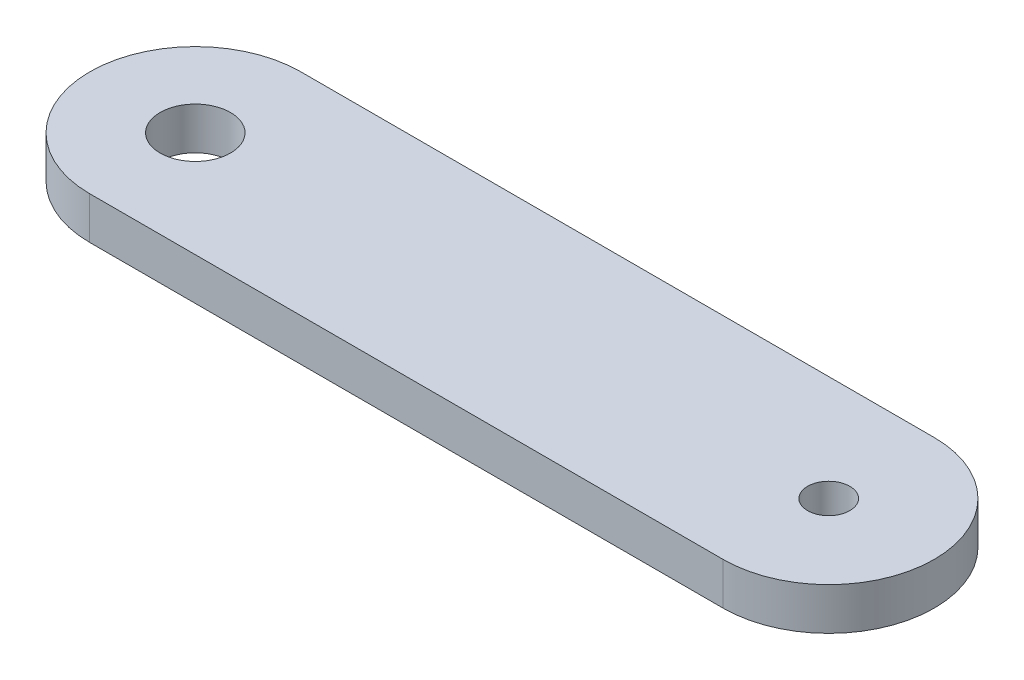
ISO-10303-21;
HEADER;
FILE_DESCRIPTION(('STEP AP214'),'2;1');
FILE_NAME('part.step','',(''),(''),'','','');
FILE_SCHEMA(('AUTOMOTIVE_DESIGN { 1 0 10303 214 1 1 1 1 }'));
ENDSEC;
DATA;
#1=APPLICATION_CONTEXT('core data for automotive mechanical design processes');
#2=APPLICATION_PROTOCOL_DEFINITION('international standard','automotive_design',2000,#1);
#3=PRODUCT_CONTEXT('',#1,'mechanical');
#4=PRODUCT('Part','Part','',(#3));
#5=PRODUCT_RELATED_PRODUCT_CATEGORY('part','',(#4));
#6=PRODUCT_DEFINITION_FORMATION('','',#4);
#7=PRODUCT_DEFINITION_CONTEXT('part definition',#1,'design');
#8=PRODUCT_DEFINITION('design','',#6,#7);
#9=PRODUCT_DEFINITION_SHAPE('','',#8);
#10=(LENGTH_UNIT() NAMED_UNIT(*) SI_UNIT(.MILLI.,.METRE.));
#11=(NAMED_UNIT(*) PLANE_ANGLE_UNIT() SI_UNIT($,.RADIAN.));
#12=(NAMED_UNIT(*) SI_UNIT($,.STERADIAN.) SOLID_ANGLE_UNIT());
#13=UNCERTAINTY_MEASURE_WITH_UNIT(LENGTH_MEASURE(1.E-05),#10,'distance_accuracy_value','');
#14=(GEOMETRIC_REPRESENTATION_CONTEXT(3) GLOBAL_UNCERTAINTY_ASSIGNED_CONTEXT((#13)) GLOBAL_UNIT_ASSIGNED_CONTEXT((#10,
#11,#12)) REPRESENTATION_CONTEXT('',''));
#15=CARTESIAN_POINT('',(0.,0.,0.));
#16=DIRECTION('',(0.,0.,1.));
#17=DIRECTION('',(1.,0.,0.));
#18=AXIS2_PLACEMENT_3D('',#15,#16,#17);
#19=CARTESIAN_POINT('',(45.,6.,0.));
#20=DIRECTION('',(0.,1.,0.));
#21=DIRECTION('',(0.,0.,1.));
#22=AXIS2_PLACEMENT_3D('',#19,#20,#21);
#23=PLANE('',#22);
#24=CARTESIAN_POINT('',(-45.,6.,0.));
#25=DIRECTION('',(0.,1.,0.));
#26=DIRECTION('',(0.,0.,1.));
#27=AXIS2_PLACEMENT_3D('',#24,#25,#26);
#28=CIRCLE('',#27,5.);
#29=CARTESIAN_POINT('',(-45.,6.,5.));
#30=VERTEX_POINT('',#29);
#31=EDGE_CURVE('E112',#30,#30,#28,.T.);
#32=ORIENTED_EDGE('',*,*,#31,.F.);
#33=EDGE_LOOP('',(#32));
#34=FACE_BOUND('',#33,.T.);
#35=CARTESIAN_POINT('',(45.,6.,0.));
#36=DIRECTION('',(0.,1.,0.));
#37=DIRECTION('',(0.,0.,1.));
#38=AXIS2_PLACEMENT_3D('',#35,#36,#37);
#39=CIRCLE('',#38,15.);
#40=CARTESIAN_POINT('',(45.,6.,15.));
#41=VERTEX_POINT('',#40);
#42=CARTESIAN_POINT('',(45.,6.,-15.));
#43=VERTEX_POINT('',#42);
#44=EDGE_CURVE('E92',#41,#43,#39,.T.);
#45=ORIENTED_EDGE('',*,*,#44,.T.);
#46=DIRECTION('',(-1.,0.,0.));
#47=VECTOR('',#46,1.);
#48=CARTESIAN_POINT('',(-45.,6.,-15.));
#49=LINE('',#48,#47);
#50=CARTESIAN_POINT('',(-45.,6.,-15.));
#51=VERTEX_POINT('',#50);
#52=EDGE_CURVE('E87',#43,#51,#49,.T.);
#53=ORIENTED_EDGE('',*,*,#52,.T.);
#54=CARTESIAN_POINT('',(-45.,6.,0.));
#55=DIRECTION('',(0.,1.,0.));
#56=DIRECTION('',(0.,0.,1.));
#57=AXIS2_PLACEMENT_3D('',#54,#55,#56);
#58=CIRCLE('',#57,15.);
#59=CARTESIAN_POINT('',(-45.,6.,15.));
#60=VERTEX_POINT('',#59);
#61=EDGE_CURVE('E90',#51,#60,#58,.T.);
#62=ORIENTED_EDGE('',*,*,#61,.T.);
#63=DIRECTION('',(1.,0.,0.));
#64=VECTOR('',#63,1.);
#65=CARTESIAN_POINT('',(-45.,6.,15.));
#66=LINE('',#65,#64);
#67=EDGE_CURVE('E57',#60,#41,#66,.T.);
#68=ORIENTED_EDGE('',*,*,#67,.T.);
#69=EDGE_LOOP('',(#45,#53,#62,#68));
#70=FACE_BOUND('',#69,.T.);
#71=CARTESIAN_POINT('',(45.,6.,0.));
#72=DIRECTION('',(0.,1.,0.));
#73=DIRECTION('',(0.,0.,1.));
#74=AXIS2_PLACEMENT_3D('',#71,#72,#73);
#75=CIRCLE('',#74,3.);
#76=CARTESIAN_POINT('',(45.,6.,3.));
#77=VERTEX_POINT('',#76);
#78=EDGE_CURVE('E134',#77,#77,#75,.T.);
#79=ORIENTED_EDGE('',*,*,#78,.F.);
#80=EDGE_LOOP('',(#79));
#81=FACE_BOUND('',#80,.T.);
#82=ADVANCED_FACE('F39',(#34,#70,#81),#23,.T.);
#83=CARTESIAN_POINT('',(45.,0.,0.));
#84=DIRECTION('',(0.,1.,0.));
#85=DIRECTION('',(0.,0.,1.));
#86=AXIS2_PLACEMENT_3D('',#83,#84,#85);
#87=PLANE('',#86);
#88=CARTESIAN_POINT('',(45.,0.,0.));
#89=DIRECTION('',(0.,1.,0.));
#90=DIRECTION('',(0.,0.,1.));
#91=AXIS2_PLACEMENT_3D('',#88,#89,#90);
#92=CIRCLE('',#91,15.);
#93=CARTESIAN_POINT('',(45.,0.,15.));
#94=VERTEX_POINT('',#93);
#95=CARTESIAN_POINT('',(45.,0.,-15.));
#96=VERTEX_POINT('',#95);
#97=EDGE_CURVE('E108',#94,#96,#92,.T.);
#98=ORIENTED_EDGE('',*,*,#97,.F.);
#99=DIRECTION('',(1.,0.,0.));
#100=VECTOR('',#99,1.);
#101=CARTESIAN_POINT('',(-45.,0.,15.));
#102=LINE('',#101,#100);
#103=CARTESIAN_POINT('',(-45.,0.,15.));
#104=VERTEX_POINT('',#103);
#105=EDGE_CURVE('E80',#104,#94,#102,.T.);
#106=ORIENTED_EDGE('',*,*,#105,.F.);
#107=CARTESIAN_POINT('',(-45.,0.,0.));
#108=DIRECTION('',(0.,1.,0.));
#109=DIRECTION('',(0.,0.,1.));
#110=AXIS2_PLACEMENT_3D('',#107,#108,#109);
#111=CIRCLE('',#110,15.);
#112=CARTESIAN_POINT('',(-45.,0.,-15.));
#113=VERTEX_POINT('',#112);
#114=EDGE_CURVE('E74',#113,#104,#111,.T.);
#115=ORIENTED_EDGE('',*,*,#114,.F.);
#116=DIRECTION('',(-1.,0.,0.));
#117=VECTOR('',#116,1.);
#118=CARTESIAN_POINT('',(-45.,0.,-15.));
#119=LINE('',#118,#117);
#120=EDGE_CURVE('E97',#96,#113,#119,.T.);
#121=ORIENTED_EDGE('',*,*,#120,.F.);
#122=EDGE_LOOP('',(#98,#106,#115,#121));
#123=FACE_BOUND('',#122,.T.);
#124=CARTESIAN_POINT('',(-45.,0.,0.));
#125=DIRECTION('',(0.,1.,0.));
#126=DIRECTION('',(0.,0.,1.));
#127=AXIS2_PLACEMENT_3D('',#124,#125,#126);
#128=CIRCLE('',#127,5.);
#129=CARTESIAN_POINT('',(-45.,0.,5.));
#130=VERTEX_POINT('',#129);
#131=EDGE_CURVE('E130',#130,#130,#128,.T.);
#132=ORIENTED_EDGE('',*,*,#131,.T.);
#133=EDGE_LOOP('',(#132));
#134=FACE_BOUND('',#133,.T.);
#135=CARTESIAN_POINT('',(45.,0.,0.));
#136=DIRECTION('',(0.,1.,0.));
#137=DIRECTION('',(0.,0.,1.));
#138=AXIS2_PLACEMENT_3D('',#135,#136,#137);
#139=CIRCLE('',#138,3.);
#140=CARTESIAN_POINT('',(45.,0.,3.));
#141=VERTEX_POINT('',#140);
#142=EDGE_CURVE('E138',#141,#141,#139,.T.);
#143=ORIENTED_EDGE('',*,*,#142,.T.);
#144=EDGE_LOOP('',(#143));
#145=FACE_BOUND('',#144,.T.);
#146=ADVANCED_FACE('F125',(#123,#134,#145),#87,.F.);
#147=CARTESIAN_POINT('',(45.,6.,0.));
#148=DIRECTION('',(0.,-1.,0.));
#149=DIRECTION('',(0.,0.,-1.));
#150=AXIS2_PLACEMENT_3D('',#147,#148,#149);
#151=CYLINDRICAL_SURFACE('',#150,15.);
#152=ORIENTED_EDGE('',*,*,#97,.T.);
#153=DIRECTION('',(0.,-1.,0.));
#154=VECTOR('',#153,1.);
#155=CARTESIAN_POINT('',(45.,6.,-15.));
#156=LINE('',#155,#154);
#157=EDGE_CURVE('E11',#43,#96,#156,.T.);
#158=ORIENTED_EDGE('',*,*,#157,.F.);
#159=ORIENTED_EDGE('',*,*,#44,.F.);
#160=DIRECTION('',(0.,-1.,0.));
#161=VECTOR('',#160,1.);
#162=CARTESIAN_POINT('',(45.,6.,15.));
#163=LINE('',#162,#161);
#164=EDGE_CURVE('E104',#41,#94,#163,.T.);
#165=ORIENTED_EDGE('',*,*,#164,.T.);
#166=EDGE_LOOP('',(#152,#158,#159,#165));
#167=FACE_BOUND('',#166,.T.);
#168=ADVANCED_FACE('F41',(#167),#151,.T.);
#169=CARTESIAN_POINT('',(-45.,6.,-15.));
#170=DIRECTION('',(0.,0.,1.));
#171=DIRECTION('',(1.,0.,0.));
#172=AXIS2_PLACEMENT_3D('',#169,#170,#171);
#173=PLANE('',#172);
#174=ORIENTED_EDGE('',*,*,#120,.T.);
#175=DIRECTION('',(0.,-1.,0.));
#176=VECTOR('',#175,1.);
#177=CARTESIAN_POINT('',(-45.,6.,-15.));
#178=LINE('',#177,#176);
#179=EDGE_CURVE('E49',#51,#113,#178,.T.);
#180=ORIENTED_EDGE('',*,*,#179,.F.);
#181=ORIENTED_EDGE('',*,*,#52,.F.);
#182=ORIENTED_EDGE('',*,*,#157,.T.);
#183=EDGE_LOOP('',(#174,#180,#181,#182));
#184=FACE_BOUND('',#183,.T.);
#185=ADVANCED_FACE('F96',(#184),#173,.F.);
#186=CARTESIAN_POINT('',(-45.,6.,0.));
#187=DIRECTION('',(0.,-1.,0.));
#188=DIRECTION('',(0.,0.,-1.));
#189=AXIS2_PLACEMENT_3D('',#186,#187,#188);
#190=CYLINDRICAL_SURFACE('',#189,15.);
#191=ORIENTED_EDGE('',*,*,#114,.T.);
#192=DIRECTION('',(0.,-1.,0.));
#193=VECTOR('',#192,1.);
#194=CARTESIAN_POINT('',(-45.,6.,15.));
#195=LINE('',#194,#193);
#196=EDGE_CURVE('E99',#60,#104,#195,.T.);
#197=ORIENTED_EDGE('',*,*,#196,.F.);
#198=ORIENTED_EDGE('',*,*,#61,.F.);
#199=ORIENTED_EDGE('',*,*,#179,.T.);
#200=EDGE_LOOP('',(#191,#197,#198,#199));
#201=FACE_BOUND('',#200,.T.);
#202=ADVANCED_FACE('F100',(#201),#190,.T.);
#203=CARTESIAN_POINT('',(-45.,6.,15.));
#204=DIRECTION('',(0.,0.,-1.));
#205=DIRECTION('',(-1.,0.,0.));
#206=AXIS2_PLACEMENT_3D('',#203,#204,#205);
#207=PLANE('',#206);
#208=ORIENTED_EDGE('',*,*,#105,.T.);
#209=ORIENTED_EDGE('',*,*,#164,.F.);
#210=ORIENTED_EDGE('',*,*,#67,.F.);
#211=ORIENTED_EDGE('',*,*,#196,.T.);
#212=EDGE_LOOP('',(#208,#209,#210,#211));
#213=FACE_BOUND('',#212,.T.);
#214=ADVANCED_FACE('F122',(#213),#207,.F.);
#215=CARTESIAN_POINT('',(-45.,6.,0.));
#216=DIRECTION('',(0.,-1.,0.));
#217=DIRECTION('',(0.,0.,-1.));
#218=AXIS2_PLACEMENT_3D('',#215,#216,#217);
#219=CYLINDRICAL_SURFACE('',#218,5.);
#220=ORIENTED_EDGE('',*,*,#31,.T.);
#221=EDGE_LOOP('',(#220));
#222=FACE_BOUND('',#221,.T.);
#223=ORIENTED_EDGE('',*,*,#131,.F.);
#224=EDGE_LOOP('',(#223));
#225=FACE_BOUND('',#224,.T.);
#226=ADVANCED_FACE('F157',(#222,#225),#219,.F.);
#227=CARTESIAN_POINT('',(45.,6.,0.));
#228=DIRECTION('',(0.,-1.,0.));
#229=DIRECTION('',(0.,0.,-1.));
#230=AXIS2_PLACEMENT_3D('',#227,#228,#229);
#231=CYLINDRICAL_SURFACE('',#230,3.);
#232=ORIENTED_EDGE('',*,*,#78,.T.);
#233=EDGE_LOOP('',(#232));
#234=FACE_BOUND('',#233,.T.);
#235=ORIENTED_EDGE('',*,*,#142,.F.);
#236=EDGE_LOOP('',(#235));
#237=FACE_BOUND('',#236,.T.);
#238=ADVANCED_FACE('F146',(#234,#237),#231,.F.);
#239=CLOSED_SHELL('',(#82,#146,#168,#185,#202,#214,#226,#238));
#240=MANIFOLD_SOLID_BREP('B2',#239);
#241=ADVANCED_BREP_SHAPE_REPRESENTATION('',(#18,#240),#14);
#242=SHAPE_DEFINITION_REPRESENTATION(#9,#241);
ENDSEC;
END-ISO-10303-21;
